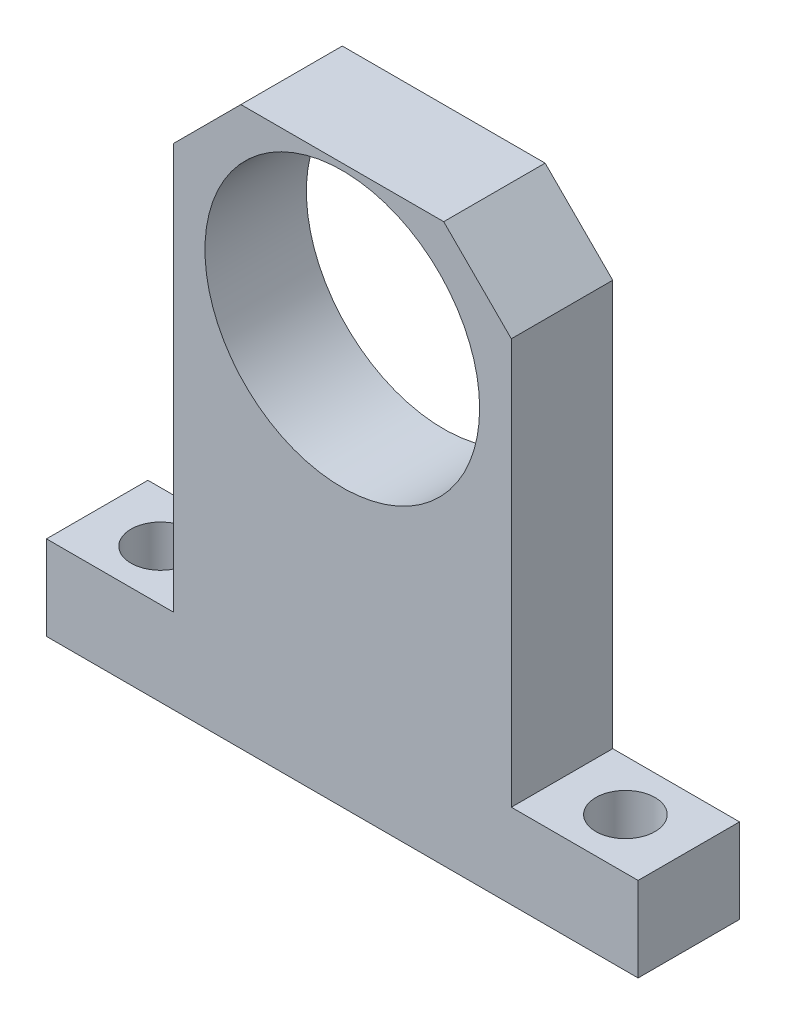
ISO-10303-21;
HEADER;
FILE_DESCRIPTION(('STEP AP214'),'2;1');
FILE_NAME('part.step','',(''),(''),'','','');
FILE_SCHEMA(('AUTOMOTIVE_DESIGN { 1 0 10303 214 1 1 1 1 }'));
ENDSEC;
DATA;
#1=APPLICATION_CONTEXT('core data for automotive mechanical design processes');
#2=APPLICATION_PROTOCOL_DEFINITION('international standard','automotive_design',2000,#1);
#3=PRODUCT_CONTEXT('',#1,'mechanical');
#4=PRODUCT('Part','Part','',(#3));
#5=PRODUCT_RELATED_PRODUCT_CATEGORY('part','',(#4));
#6=PRODUCT_DEFINITION_FORMATION('','',#4);
#7=PRODUCT_DEFINITION_CONTEXT('part definition',#1,'design');
#8=PRODUCT_DEFINITION('design','',#6,#7);
#9=PRODUCT_DEFINITION_SHAPE('','',#8);
#10=(LENGTH_UNIT() NAMED_UNIT(*) SI_UNIT(.MILLI.,.METRE.));
#11=(NAMED_UNIT(*) PLANE_ANGLE_UNIT() SI_UNIT($,.RADIAN.));
#12=(NAMED_UNIT(*) SI_UNIT($,.STERADIAN.) SOLID_ANGLE_UNIT());
#13=UNCERTAINTY_MEASURE_WITH_UNIT(LENGTH_MEASURE(1.E-05),#10,'distance_accuracy_value','');
#14=(GEOMETRIC_REPRESENTATION_CONTEXT(3) GLOBAL_UNCERTAINTY_ASSIGNED_CONTEXT((#13)) GLOBAL_UNIT_ASSIGNED_CONTEXT((#10,
#11,#12)) REPRESENTATION_CONTEXT('',''));
#15=CARTESIAN_POINT('',(0.,0.,0.));
#16=DIRECTION('',(0.,0.,1.));
#17=DIRECTION('',(1.,0.,0.));
#18=AXIS2_PLACEMENT_3D('',#15,#16,#17);
#19=CARTESIAN_POINT('',(0.,0.,12.));
#20=DIRECTION('',(0.,0.,1.));
#21=DIRECTION('',(1.,0.,0.));
#22=AXIS2_PLACEMENT_3D('',#19,#20,#21);
#23=PLANE('',#22);
#24=DIRECTION('',(0.,1.,0.));
#25=VECTOR('',#24,1.);
#26=CARTESIAN_POINT('',(40.,0.,12.));
#27=LINE('',#26,#25);
#28=CARTESIAN_POINT('',(40.,0.,12.));
#29=VERTEX_POINT('',#28);
#30=CARTESIAN_POINT('',(40.,48.,12.));
#31=VERTEX_POINT('',#30);
#32=EDGE_CURVE('E174',#29,#31,#27,.T.);
#33=ORIENTED_EDGE('',*,*,#32,.T.);
#34=DIRECTION('',(-0.707106781186546,0.707106781186549,0.));
#35=VECTOR('',#34,1.);
#36=CARTESIAN_POINT('',(44.,43.9999999999999,12.));
#37=LINE('',#36,#35);
#38=CARTESIAN_POINT('',(32.,56.,12.));
#39=VERTEX_POINT('',#38);
#40=EDGE_CURVE('E12',#31,#39,#37,.T.);
#41=ORIENTED_EDGE('',*,*,#40,.T.);
#42=DIRECTION('',(1.,0.,0.));
#43=VECTOR('',#42,1.);
#44=CARTESIAN_POINT('',(0.,56.,12.));
#45=LINE('',#44,#43);
#46=CARTESIAN_POINT('',(8.00000000000002,56.,12.));
#47=VERTEX_POINT('',#46);
#48=EDGE_CURVE('E159',#47,#39,#45,.T.);
#49=ORIENTED_EDGE('',*,*,#48,.F.);
#50=DIRECTION('',(0.707106781186549,0.707106781186546,0.));
#51=VECTOR('',#50,1.);
#52=CARTESIAN_POINT('',(-24.,24.0000000000001,12.));
#53=LINE('',#52,#51);
#54=CARTESIAN_POINT('',(0.,48.,12.));
#55=VERTEX_POINT('',#54);
#56=EDGE_CURVE('E158',#47,#55,#53,.F.);
#57=ORIENTED_EDGE('',*,*,#56,.T.);
#58=DIRECTION('',(0.,1.,0.));
#59=VECTOR('',#58,1.);
#60=CARTESIAN_POINT('',(0.,0.,12.));
#61=LINE('',#60,#59);
#62=CARTESIAN_POINT('',(0.,0.,12.));
#63=VERTEX_POINT('',#62);
#64=EDGE_CURVE('E141',#63,#55,#61,.T.);
#65=ORIENTED_EDGE('',*,*,#64,.F.);
#66=DIRECTION('',(1.,0.,0.));
#67=VECTOR('',#66,1.);
#68=CARTESIAN_POINT('',(-15.,0.,12.));
#69=LINE('',#68,#67);
#70=CARTESIAN_POINT('',(-15.,0.,12.));
#71=VERTEX_POINT('',#70);
#72=EDGE_CURVE('E155',#71,#63,#69,.T.);
#73=ORIENTED_EDGE('',*,*,#72,.F.);
#74=DIRECTION('',(0.,-1.,0.));
#75=VECTOR('',#74,1.);
#76=CARTESIAN_POINT('',(-15.,0.,12.));
#77=LINE('',#76,#75);
#78=CARTESIAN_POINT('',(-15.,-10.,12.));
#79=VERTEX_POINT('',#78);
#80=EDGE_CURVE('E150',#71,#79,#77,.T.);
#81=ORIENTED_EDGE('',*,*,#80,.T.);
#82=DIRECTION('',(1.,0.,0.));
#83=VECTOR('',#82,1.);
#84=CARTESIAN_POINT('',(-15.,-10.,12.));
#85=LINE('',#84,#83);
#86=CARTESIAN_POINT('',(55.,-10.,12.));
#87=VERTEX_POINT('',#86);
#88=EDGE_CURVE('E182',#79,#87,#85,.T.);
#89=ORIENTED_EDGE('',*,*,#88,.T.);
#90=DIRECTION('',(0.,-1.,0.));
#91=VECTOR('',#90,1.);
#92=CARTESIAN_POINT('',(55.,0.,12.));
#93=LINE('',#92,#91);
#94=CARTESIAN_POINT('',(55.,0.,12.));
#95=VERTEX_POINT('',#94);
#96=EDGE_CURVE('E179',#95,#87,#93,.T.);
#97=ORIENTED_EDGE('',*,*,#96,.F.);
#98=DIRECTION('',(1.,0.,0.));
#99=VECTOR('',#98,1.);
#100=CARTESIAN_POINT('',(40.,0.,12.));
#101=LINE('',#100,#99);
#102=EDGE_CURVE('E176',#29,#95,#101,.T.);
#103=ORIENTED_EDGE('',*,*,#102,.F.);
#104=EDGE_LOOP('',(#33,#41,#49,#57,#65,#73,#81,#89,#97,#103));
#105=FACE_BOUND('',#104,.T.);
#106=CARTESIAN_POINT('',(20.,39.,12.));
#107=DIRECTION('',(0.,0.,1.));
#108=DIRECTION('',(1.,0.,0.));
#109=AXIS2_PLACEMENT_3D('',#106,#107,#108);
#110=CIRCLE('',#109,16.25);
#111=CARTESIAN_POINT('',(36.25,39.,12.));
#112=VERTEX_POINT('',#111);
#113=EDGE_CURVE('E187',#112,#112,#110,.T.);
#114=ORIENTED_EDGE('',*,*,#113,.F.);
#115=EDGE_LOOP('',(#114));
#116=FACE_BOUND('',#115,.T.);
#117=ADVANCED_FACE('F60',(#105,#116),#23,.T.);
#118=CARTESIAN_POINT('',(0.,0.,0.));
#119=DIRECTION('',(0.,0.,1.));
#120=DIRECTION('',(1.,0.,0.));
#121=AXIS2_PLACEMENT_3D('',#118,#119,#120);
#122=PLANE('',#121);
#123=DIRECTION('',(1.,0.,0.));
#124=VECTOR('',#123,1.);
#125=CARTESIAN_POINT('',(0.,56.,0.));
#126=LINE('',#125,#124);
#127=CARTESIAN_POINT('',(8.00000000000002,56.,0.));
#128=VERTEX_POINT('',#127);
#129=CARTESIAN_POINT('',(32.,56.,0.));
#130=VERTEX_POINT('',#129);
#131=EDGE_CURVE('E189',#128,#130,#126,.T.);
#132=ORIENTED_EDGE('',*,*,#131,.T.);
#133=DIRECTION('',(0.707106781186546,-0.707106781186549,0.));
#134=VECTOR('',#133,1.);
#135=CARTESIAN_POINT('',(32.,56.,0.));
#136=LINE('',#135,#134);
#137=CARTESIAN_POINT('',(40.,48.,0.));
#138=VERTEX_POINT('',#137);
#139=EDGE_CURVE('E82',#130,#138,#136,.T.);
#140=ORIENTED_EDGE('',*,*,#139,.T.);
#141=DIRECTION('',(0.,1.,0.));
#142=VECTOR('',#141,1.);
#143=CARTESIAN_POINT('',(40.,0.,0.));
#144=LINE('',#143,#142);
#145=CARTESIAN_POINT('',(40.,0.,0.));
#146=VERTEX_POINT('',#145);
#147=EDGE_CURVE('E191',#146,#138,#144,.T.);
#148=ORIENTED_EDGE('',*,*,#147,.F.);
#149=DIRECTION('',(1.,0.,0.));
#150=VECTOR('',#149,1.);
#151=CARTESIAN_POINT('',(40.,0.,0.));
#152=LINE('',#151,#150);
#153=CARTESIAN_POINT('',(55.,0.,0.));
#154=VERTEX_POINT('',#153);
#155=EDGE_CURVE('E193',#146,#154,#152,.T.);
#156=ORIENTED_EDGE('',*,*,#155,.T.);
#157=DIRECTION('',(0.,-1.,0.));
#158=VECTOR('',#157,1.);
#159=CARTESIAN_POINT('',(55.,0.,0.));
#160=LINE('',#159,#158);
#161=CARTESIAN_POINT('',(55.,-10.,0.));
#162=VERTEX_POINT('',#161);
#163=EDGE_CURVE('E196',#154,#162,#160,.T.);
#164=ORIENTED_EDGE('',*,*,#163,.T.);
#165=DIRECTION('',(1.,0.,0.));
#166=VECTOR('',#165,1.);
#167=CARTESIAN_POINT('',(-15.,-10.,0.));
#168=LINE('',#167,#166);
#169=CARTESIAN_POINT('',(-15.,-10.,0.));
#170=VERTEX_POINT('',#169);
#171=EDGE_CURVE('E166',#170,#162,#168,.T.);
#172=ORIENTED_EDGE('',*,*,#171,.F.);
#173=DIRECTION('',(0.,-1.,0.));
#174=VECTOR('',#173,1.);
#175=CARTESIAN_POINT('',(-15.,0.,0.));
#176=LINE('',#175,#174);
#177=CARTESIAN_POINT('',(-15.,0.,0.));
#178=VERTEX_POINT('',#177);
#179=EDGE_CURVE('E164',#178,#170,#176,.T.);
#180=ORIENTED_EDGE('',*,*,#179,.F.);
#181=DIRECTION('',(1.,0.,0.));
#182=VECTOR('',#181,1.);
#183=CARTESIAN_POINT('',(-15.,0.,0.));
#184=LINE('',#183,#182);
#185=CARTESIAN_POINT('',(0.,0.,0.));
#186=VERTEX_POINT('',#185);
#187=EDGE_CURVE('E185',#178,#186,#184,.T.);
#188=ORIENTED_EDGE('',*,*,#187,.T.);
#189=DIRECTION('',(0.,1.,0.));
#190=VECTOR('',#189,1.);
#191=CARTESIAN_POINT('',(0.,0.,0.));
#192=LINE('',#191,#190);
#193=CARTESIAN_POINT('',(0.,48.,0.));
#194=VERTEX_POINT('',#193);
#195=EDGE_CURVE('E144',#186,#194,#192,.T.);
#196=ORIENTED_EDGE('',*,*,#195,.T.);
#197=DIRECTION('',(-0.707106781186549,-0.707106781186546,0.));
#198=VECTOR('',#197,1.);
#199=CARTESIAN_POINT('',(0.,48.,0.));
#200=LINE('',#199,#198);
#201=EDGE_CURVE('E212',#194,#128,#200,.F.);
#202=ORIENTED_EDGE('',*,*,#201,.T.);
#203=EDGE_LOOP('',(#132,#140,#148,#156,#164,#172,#180,#188,#196,#202));
#204=FACE_BOUND('',#203,.T.);
#205=CARTESIAN_POINT('',(20.,39.,0.));
#206=DIRECTION('',(0.,0.,1.));
#207=DIRECTION('',(1.,0.,0.));
#208=AXIS2_PLACEMENT_3D('',#205,#206,#207);
#209=CIRCLE('',#208,16.25);
#210=CARTESIAN_POINT('',(36.25,39.,0.));
#211=VERTEX_POINT('',#210);
#212=EDGE_CURVE('E169',#211,#211,#209,.T.);
#213=ORIENTED_EDGE('',*,*,#212,.T.);
#214=EDGE_LOOP('',(#213));
#215=FACE_BOUND('',#214,.T.);
#216=ADVANCED_FACE('F227',(#204,#215),#122,.F.);
#217=CARTESIAN_POINT('',(-15.,0.,12.));
#218=DIRECTION('',(0.,1.,0.));
#219=DIRECTION('',(0.,0.,1.));
#220=AXIS2_PLACEMENT_3D('',#217,#218,#219);
#221=PLANE('',#220);
#222=CARTESIAN_POINT('',(-7.5,0.,6.));
#223=DIRECTION('',(0.,1.,0.));
#224=DIRECTION('',(0.,0.,1.));
#225=AXIS2_PLACEMENT_3D('',#222,#223,#224);
#226=CIRCLE('',#225,3.5);
#227=CARTESIAN_POINT('',(-7.5,0.,9.5));
#228=VERTEX_POINT('',#227);
#229=EDGE_CURVE('E276',#228,#228,#226,.T.);
#230=ORIENTED_EDGE('',*,*,#229,.F.);
#231=EDGE_LOOP('',(#230));
#232=FACE_BOUND('',#231,.T.);
#233=ORIENTED_EDGE('',*,*,#187,.F.);
#234=DIRECTION('',(0.,0.,-1.));
#235=VECTOR('',#234,1.);
#236=CARTESIAN_POINT('',(-15.,0.,12.));
#237=LINE('',#236,#235);
#238=EDGE_CURVE('E162',#71,#178,#237,.T.);
#239=ORIENTED_EDGE('',*,*,#238,.F.);
#240=ORIENTED_EDGE('',*,*,#72,.T.);
#241=DIRECTION('',(0.,0.,-1.));
#242=VECTOR('',#241,1.);
#243=CARTESIAN_POINT('',(0.,0.,12.));
#244=LINE('',#243,#242);
#245=EDGE_CURVE('E137',#63,#186,#244,.T.);
#246=ORIENTED_EDGE('',*,*,#245,.T.);
#247=EDGE_LOOP('',(#233,#239,#240,#246));
#248=FACE_BOUND('',#247,.T.);
#249=ADVANCED_FACE('F161',(#232,#248),#221,.T.);
#250=CARTESIAN_POINT('',(-15.,0.,12.));
#251=DIRECTION('',(1.,0.,0.));
#252=DIRECTION('',(0.,1.,0.));
#253=AXIS2_PLACEMENT_3D('',#250,#251,#252);
#254=PLANE('',#253);
#255=ORIENTED_EDGE('',*,*,#179,.T.);
#256=DIRECTION('',(0.,0.,-1.));
#257=VECTOR('',#256,1.);
#258=CARTESIAN_POINT('',(-15.,-10.,12.));
#259=LINE('',#258,#257);
#260=EDGE_CURVE('E203',#79,#170,#259,.T.);
#261=ORIENTED_EDGE('',*,*,#260,.F.);
#262=ORIENTED_EDGE('',*,*,#80,.F.);
#263=ORIENTED_EDGE('',*,*,#238,.T.);
#264=EDGE_LOOP('',(#255,#261,#262,#263));
#265=FACE_BOUND('',#264,.T.);
#266=ADVANCED_FACE('F247',(#265),#254,.F.);
#267=CARTESIAN_POINT('',(-15.,-10.,12.));
#268=DIRECTION('',(0.,1.,0.));
#269=DIRECTION('',(0.,0.,1.));
#270=AXIS2_PLACEMENT_3D('',#267,#268,#269);
#271=PLANE('',#270);
#272=CARTESIAN_POINT('',(-7.5,-10.,6.));
#273=DIRECTION('',(0.,1.,0.));
#274=DIRECTION('',(0.,0.,1.));
#275=AXIS2_PLACEMENT_3D('',#272,#273,#274);
#276=CIRCLE('',#275,3.5);
#277=CARTESIAN_POINT('',(-7.5,-10.,9.5));
#278=VERTEX_POINT('',#277);
#279=EDGE_CURVE('E278',#278,#278,#276,.T.);
#280=ORIENTED_EDGE('',*,*,#279,.T.);
#281=EDGE_LOOP('',(#280));
#282=FACE_BOUND('',#281,.T.);
#283=CARTESIAN_POINT('',(47.5,-10.,6.));
#284=DIRECTION('',(0.,1.,0.));
#285=DIRECTION('',(0.,0.,1.));
#286=AXIS2_PLACEMENT_3D('',#283,#284,#285);
#287=CIRCLE('',#286,3.5);
#288=CARTESIAN_POINT('',(47.5,-10.,9.5));
#289=VERTEX_POINT('',#288);
#290=EDGE_CURVE('E284',#289,#289,#287,.T.);
#291=ORIENTED_EDGE('',*,*,#290,.T.);
#292=EDGE_LOOP('',(#291));
#293=FACE_BOUND('',#292,.T.);
#294=ORIENTED_EDGE('',*,*,#171,.T.);
#295=DIRECTION('',(0.,0.,-1.));
#296=VECTOR('',#295,1.);
#297=CARTESIAN_POINT('',(55.,-10.,12.));
#298=LINE('',#297,#296);
#299=EDGE_CURVE('E206',#87,#162,#298,.T.);
#300=ORIENTED_EDGE('',*,*,#299,.F.);
#301=ORIENTED_EDGE('',*,*,#88,.F.);
#302=ORIENTED_EDGE('',*,*,#260,.T.);
#303=EDGE_LOOP('',(#294,#300,#301,#302));
#304=FACE_BOUND('',#303,.T.);
#305=ADVANCED_FACE('F250',(#282,#293,#304),#271,.F.);
#306=CARTESIAN_POINT('',(55.,0.,12.));
#307=DIRECTION('',(1.,0.,0.));
#308=DIRECTION('',(0.,1.,0.));
#309=AXIS2_PLACEMENT_3D('',#306,#307,#308);
#310=PLANE('',#309);
#311=ORIENTED_EDGE('',*,*,#163,.F.);
#312=DIRECTION('',(0.,0.,-1.));
#313=VECTOR('',#312,1.);
#314=CARTESIAN_POINT('',(55.,0.,12.));
#315=LINE('',#314,#313);
#316=EDGE_CURVE('E208',#95,#154,#315,.T.);
#317=ORIENTED_EDGE('',*,*,#316,.F.);
#318=ORIENTED_EDGE('',*,*,#96,.T.);
#319=ORIENTED_EDGE('',*,*,#299,.T.);
#320=EDGE_LOOP('',(#311,#317,#318,#319));
#321=FACE_BOUND('',#320,.T.);
#322=ADVANCED_FACE('F254',(#321),#310,.T.);
#323=CARTESIAN_POINT('',(40.,0.,12.));
#324=DIRECTION('',(0.,1.,0.));
#325=DIRECTION('',(0.,0.,1.));
#326=AXIS2_PLACEMENT_3D('',#323,#324,#325);
#327=PLANE('',#326);
#328=CARTESIAN_POINT('',(47.5,0.,6.));
#329=DIRECTION('',(0.,1.,0.));
#330=DIRECTION('',(0.,0.,1.));
#331=AXIS2_PLACEMENT_3D('',#328,#329,#330);
#332=CIRCLE('',#331,3.5);
#333=CARTESIAN_POINT('',(47.5,0.,9.5));
#334=VERTEX_POINT('',#333);
#335=EDGE_CURVE('E281',#334,#334,#332,.T.);
#336=ORIENTED_EDGE('',*,*,#335,.F.);
#337=EDGE_LOOP('',(#336));
#338=FACE_BOUND('',#337,.T.);
#339=ORIENTED_EDGE('',*,*,#155,.F.);
#340=DIRECTION('',(0.,0.,-1.));
#341=VECTOR('',#340,1.);
#342=CARTESIAN_POINT('',(40.,0.,12.));
#343=LINE('',#342,#341);
#344=EDGE_CURVE('E149',#29,#146,#343,.T.);
#345=ORIENTED_EDGE('',*,*,#344,.F.);
#346=ORIENTED_EDGE('',*,*,#102,.T.);
#347=ORIENTED_EDGE('',*,*,#316,.T.);
#348=EDGE_LOOP('',(#339,#345,#346,#347));
#349=FACE_BOUND('',#348,.T.);
#350=ADVANCED_FACE('F258',(#338,#349),#327,.T.);
#351=CARTESIAN_POINT('',(40.,0.,12.));
#352=DIRECTION('',(-1.,0.,0.));
#353=DIRECTION('',(0.,0.,1.));
#354=AXIS2_PLACEMENT_3D('',#351,#352,#353);
#355=PLANE('',#354);
#356=ORIENTED_EDGE('',*,*,#147,.T.);
#357=DIRECTION('',(0.,0.,1.));
#358=VECTOR('',#357,1.);
#359=CARTESIAN_POINT('',(40.,48.,12.));
#360=LINE('',#359,#358);
#361=EDGE_CURVE('E68',#138,#31,#360,.T.);
#362=ORIENTED_EDGE('',*,*,#361,.T.);
#363=ORIENTED_EDGE('',*,*,#32,.F.);
#364=ORIENTED_EDGE('',*,*,#344,.T.);
#365=EDGE_LOOP('',(#356,#362,#363,#364));
#366=FACE_BOUND('',#365,.T.);
#367=ADVANCED_FACE('F262',(#366),#355,.F.);
#368=CARTESIAN_POINT('',(0.,56.,12.));
#369=DIRECTION('',(0.,1.,0.));
#370=DIRECTION('',(0.,0.,1.));
#371=AXIS2_PLACEMENT_3D('',#368,#369,#370);
#372=PLANE('',#371);
#373=ORIENTED_EDGE('',*,*,#48,.T.);
#374=DIRECTION('',(0.,0.,-1.));
#375=VECTOR('',#374,1.);
#376=CARTESIAN_POINT('',(32.,56.,0.));
#377=LINE('',#376,#375);
#378=EDGE_CURVE('E217',#39,#130,#377,.T.);
#379=ORIENTED_EDGE('',*,*,#378,.T.);
#380=ORIENTED_EDGE('',*,*,#131,.F.);
#381=DIRECTION('',(0.,0.,1.));
#382=VECTOR('',#381,1.);
#383=CARTESIAN_POINT('',(8.00000000000002,56.,12.));
#384=LINE('',#383,#382);
#385=EDGE_CURVE('E214',#128,#47,#384,.T.);
#386=ORIENTED_EDGE('',*,*,#385,.T.);
#387=EDGE_LOOP('',(#373,#379,#380,#386));
#388=FACE_BOUND('',#387,.T.);
#389=ADVANCED_FACE('F223',(#388),#372,.T.);
#390=CARTESIAN_POINT('',(0.,0.,12.));
#391=DIRECTION('',(-1.,0.,0.));
#392=DIRECTION('',(0.,0.,1.));
#393=AXIS2_PLACEMENT_3D('',#390,#391,#392);
#394=PLANE('',#393);
#395=ORIENTED_EDGE('',*,*,#64,.T.);
#396=DIRECTION('',(0.,0.,-1.));
#397=VECTOR('',#396,1.);
#398=CARTESIAN_POINT('',(0.,48.,12.));
#399=LINE('',#398,#397);
#400=EDGE_CURVE('E202',#55,#194,#399,.T.);
#401=ORIENTED_EDGE('',*,*,#400,.T.);
#402=ORIENTED_EDGE('',*,*,#195,.F.);
#403=ORIENTED_EDGE('',*,*,#245,.F.);
#404=EDGE_LOOP('',(#395,#401,#402,#403));
#405=FACE_BOUND('',#404,.T.);
#406=ADVANCED_FACE('F139',(#405),#394,.T.);
#407=CARTESIAN_POINT('',(20.,39.,12.));
#408=DIRECTION('',(0.,0.,-1.));
#409=DIRECTION('',(-1.,0.,0.));
#410=AXIS2_PLACEMENT_3D('',#407,#408,#409);
#411=CYLINDRICAL_SURFACE('',#410,16.25);
#412=ORIENTED_EDGE('',*,*,#113,.T.);
#413=EDGE_LOOP('',(#412));
#414=FACE_BOUND('',#413,.T.);
#415=ORIENTED_EDGE('',*,*,#212,.F.);
#416=EDGE_LOOP('',(#415));
#417=FACE_BOUND('',#416,.T.);
#418=ADVANCED_FACE('F244',(#414,#417),#411,.F.);
#419=CARTESIAN_POINT('',(47.5,-10.,6.));
#420=DIRECTION('',(0.,1.,0.));
#421=DIRECTION('',(0.,0.,1.));
#422=AXIS2_PLACEMENT_3D('',#419,#420,#421);
#423=CYLINDRICAL_SURFACE('',#422,3.5);
#424=ORIENTED_EDGE('',*,*,#290,.F.);
#425=EDGE_LOOP('',(#424));
#426=FACE_BOUND('',#425,.T.);
#427=ORIENTED_EDGE('',*,*,#335,.T.);
#428=EDGE_LOOP('',(#427));
#429=FACE_BOUND('',#428,.T.);
#430=ADVANCED_FACE('F295',(#426,#429),#423,.F.);
#431=CARTESIAN_POINT('',(-7.5,-10.,6.));
#432=DIRECTION('',(0.,1.,0.));
#433=DIRECTION('',(0.,0.,1.));
#434=AXIS2_PLACEMENT_3D('',#431,#432,#433);
#435=CYLINDRICAL_SURFACE('',#434,3.5);
#436=ORIENTED_EDGE('',*,*,#279,.F.);
#437=EDGE_LOOP('',(#436));
#438=FACE_BOUND('',#437,.T.);
#439=ORIENTED_EDGE('',*,*,#229,.T.);
#440=EDGE_LOOP('',(#439));
#441=FACE_BOUND('',#440,.T.);
#442=ADVANCED_FACE('F236',(#438,#441),#435,.F.);
#443=CARTESIAN_POINT('',(0.,48.,12.));
#444=DIRECTION('',(0.707106781186546,-0.707106781186549,0.));
#445=DIRECTION('',(0.,0.,-1.));
#446=AXIS2_PLACEMENT_3D('',#443,#444,#445);
#447=PLANE('',#446);
#448=ORIENTED_EDGE('',*,*,#56,.F.);
#449=ORIENTED_EDGE('',*,*,#385,.F.);
#450=ORIENTED_EDGE('',*,*,#201,.F.);
#451=ORIENTED_EDGE('',*,*,#400,.F.);
#452=EDGE_LOOP('',(#448,#449,#450,#451));
#453=FACE_BOUND('',#452,.T.);
#454=ADVANCED_FACE('F230',(#453),#447,.F.);
#455=CARTESIAN_POINT('',(32.,56.,12.));
#456=DIRECTION('',(0.707106781186549,0.707106781186546,0.));
#457=DIRECTION('',(0.,0.,1.));
#458=AXIS2_PLACEMENT_3D('',#455,#456,#457);
#459=PLANE('',#458);
#460=ORIENTED_EDGE('',*,*,#40,.F.);
#461=ORIENTED_EDGE('',*,*,#361,.F.);
#462=ORIENTED_EDGE('',*,*,#139,.F.);
#463=ORIENTED_EDGE('',*,*,#378,.F.);
#464=EDGE_LOOP('',(#460,#461,#462,#463));
#465=FACE_BOUND('',#464,.T.);
#466=ADVANCED_FACE('F62',(#465),#459,.T.);
#467=CLOSED_SHELL('',(#117,#216,#249,#266,#305,#322,#350,#367,#389,#406,#418,#430,#442,#454,#466));
#468=MANIFOLD_SOLID_BREP('B2',#467);
#469=ADVANCED_BREP_SHAPE_REPRESENTATION('',(#18,#468),#14);
#470=SHAPE_DEFINITION_REPRESENTATION(#9,#469);
ENDSEC;
END-ISO-10303-21;
